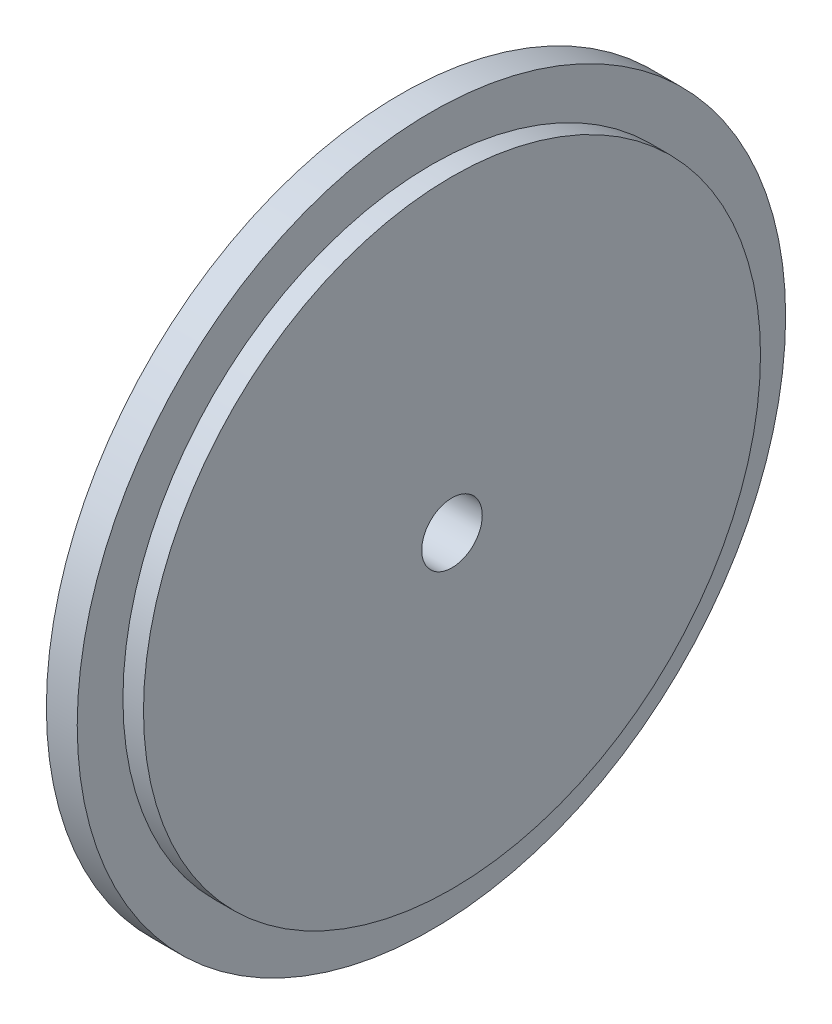
ISO-10303-21;
HEADER;
FILE_DESCRIPTION(('STEP AP214'),'2;1');
FILE_NAME('part.step','',(''),(''),'','','');
FILE_SCHEMA(('AUTOMOTIVE_DESIGN { 1 0 10303 214 1 1 1 1 }'));
ENDSEC;
DATA;
#1=APPLICATION_CONTEXT('core data for automotive mechanical design processes');
#2=APPLICATION_PROTOCOL_DEFINITION('international standard','automotive_design',2000,#1);
#3=PRODUCT_CONTEXT('',#1,'mechanical');
#4=PRODUCT('Part','Part','',(#3));
#5=PRODUCT_RELATED_PRODUCT_CATEGORY('part','',(#4));
#6=PRODUCT_DEFINITION_FORMATION('','',#4);
#7=PRODUCT_DEFINITION_CONTEXT('part definition',#1,'design');
#8=PRODUCT_DEFINITION('design','',#6,#7);
#9=PRODUCT_DEFINITION_SHAPE('','',#8);
#10=(LENGTH_UNIT() NAMED_UNIT(*) SI_UNIT(.MILLI.,.METRE.));
#11=(NAMED_UNIT(*) PLANE_ANGLE_UNIT() SI_UNIT($,.RADIAN.));
#12=(NAMED_UNIT(*) SI_UNIT($,.STERADIAN.) SOLID_ANGLE_UNIT());
#13=UNCERTAINTY_MEASURE_WITH_UNIT(LENGTH_MEASURE(1.E-05),#10,'distance_accuracy_value','');
#14=(GEOMETRIC_REPRESENTATION_CONTEXT(3) GLOBAL_UNCERTAINTY_ASSIGNED_CONTEXT((#13)) GLOBAL_UNIT_ASSIGNED_CONTEXT((#10,
#11,#12)) REPRESENTATION_CONTEXT('',''));
#15=CARTESIAN_POINT('',(0.,0.,0.));
#16=DIRECTION('',(0.,0.,1.));
#17=DIRECTION('',(1.,0.,0.));
#18=AXIS2_PLACEMENT_3D('',#15,#16,#17);
#19=CARTESIAN_POINT('',(4.5,0.,0.));
#20=DIRECTION('',(1.,0.,0.));
#21=DIRECTION('',(0.,0.,-1.));
#22=AXIS2_PLACEMENT_3D('',#19,#20,#21);
#23=PLANE('',#22);
#24=CARTESIAN_POINT('',(4.5,0.,0.));
#25=DIRECTION('',(1.,0.,0.));
#26=DIRECTION('',(0.,0.,-1.));
#27=AXIS2_PLACEMENT_3D('',#24,#25,#26);
#28=CIRCLE('',#27,2.65);
#29=CARTESIAN_POINT('',(4.5,0.,-2.65));
#30=VERTEX_POINT('',#29);
#31=EDGE_CURVE('E41',#30,#30,#28,.T.);
#32=ORIENTED_EDGE('',*,*,#31,.F.);
#33=EDGE_LOOP('',(#32));
#34=FACE_BOUND('',#33,.T.);
#35=CARTESIAN_POINT('',(4.5,0.,0.));
#36=DIRECTION('',(1.,0.,0.));
#37=DIRECTION('',(0.,0.,-1.));
#38=AXIS2_PLACEMENT_3D('',#35,#36,#37);
#39=CIRCLE('',#38,27.);
#40=CARTESIAN_POINT('',(4.5,0.,-27.));
#41=VERTEX_POINT('',#40);
#42=EDGE_CURVE('E50',#41,#41,#39,.T.);
#43=ORIENTED_EDGE('',*,*,#42,.T.);
#44=EDGE_LOOP('',(#43));
#45=FACE_BOUND('',#44,.T.);
#46=ADVANCED_FACE('F33',(#34,#45),#23,.T.);
#47=CARTESIAN_POINT('',(4.5,0.,0.));
#48=DIRECTION('',(-1.,0.,0.));
#49=DIRECTION('',(0.,0.,1.));
#50=AXIS2_PLACEMENT_3D('',#47,#48,#49);
#51=CYLINDRICAL_SURFACE('',#50,31.);
#52=CARTESIAN_POINT('',(0.,0.,0.));
#53=DIRECTION('',(1.,0.,0.));
#54=DIRECTION('',(0.,0.,-1.));
#55=AXIS2_PLACEMENT_3D('',#52,#53,#54);
#56=CIRCLE('',#55,31.);
#57=CARTESIAN_POINT('',(0.,0.,-31.));
#58=VERTEX_POINT('',#57);
#59=EDGE_CURVE('E10',#58,#58,#56,.T.);
#60=ORIENTED_EDGE('',*,*,#59,.T.);
#61=EDGE_LOOP('',(#60));
#62=FACE_BOUND('',#61,.T.);
#63=CARTESIAN_POINT('',(2.7,0.,0.));
#64=DIRECTION('',(1.,0.,0.));
#65=DIRECTION('',(0.,0.,-1.));
#66=AXIS2_PLACEMENT_3D('',#63,#64,#65);
#67=CIRCLE('',#66,31.);
#68=CARTESIAN_POINT('',(2.7,0.,-31.));
#69=VERTEX_POINT('',#68);
#70=EDGE_CURVE('E37',#69,#69,#67,.T.);
#71=ORIENTED_EDGE('',*,*,#70,.F.);
#72=EDGE_LOOP('',(#71));
#73=FACE_BOUND('',#72,.T.);
#74=ADVANCED_FACE('F35',(#62,#73),#51,.T.);
#75=CARTESIAN_POINT('',(0.,0.,0.));
#76=DIRECTION('',(1.,0.,0.));
#77=DIRECTION('',(0.,0.,-1.));
#78=AXIS2_PLACEMENT_3D('',#75,#76,#77);
#79=PLANE('',#78);
#80=ORIENTED_EDGE('',*,*,#59,.F.);
#81=EDGE_LOOP('',(#80));
#82=FACE_BOUND('',#81,.T.);
#83=CARTESIAN_POINT('',(0.,0.,0.));
#84=DIRECTION('',(1.,0.,0.));
#85=DIRECTION('',(0.,0.,-1.));
#86=AXIS2_PLACEMENT_3D('',#83,#84,#85);
#87=CIRCLE('',#86,2.65);
#88=CARTESIAN_POINT('',(0.,0.,-2.65));
#89=VERTEX_POINT('',#88);
#90=EDGE_CURVE('E45',#89,#89,#87,.T.);
#91=ORIENTED_EDGE('',*,*,#90,.T.);
#92=EDGE_LOOP('',(#91));
#93=FACE_BOUND('',#92,.T.);
#94=ADVANCED_FACE('F63',(#82,#93),#79,.F.);
#95=CARTESIAN_POINT('',(4.5,0.,0.));
#96=DIRECTION('',(-1.,0.,0.));
#97=DIRECTION('',(0.,0.,1.));
#98=AXIS2_PLACEMENT_3D('',#95,#96,#97);
#99=CYLINDRICAL_SURFACE('',#98,2.65);
#100=ORIENTED_EDGE('',*,*,#31,.T.);
#101=EDGE_LOOP('',(#100));
#102=FACE_BOUND('',#101,.T.);
#103=ORIENTED_EDGE('',*,*,#90,.F.);
#104=EDGE_LOOP('',(#103));
#105=FACE_BOUND('',#104,.T.);
#106=ADVANCED_FACE('F68',(#102,#105),#99,.F.);
#107=CARTESIAN_POINT('',(2.7,0.,0.));
#108=DIRECTION('',(1.,0.,0.));
#109=DIRECTION('',(0.,0.,-1.));
#110=AXIS2_PLACEMENT_3D('',#107,#108,#109);
#111=PLANE('',#110);
#112=CARTESIAN_POINT('',(2.7,0.,0.));
#113=DIRECTION('',(1.,0.,0.));
#114=DIRECTION('',(0.,0.,-1.));
#115=AXIS2_PLACEMENT_3D('',#112,#113,#114);
#116=CIRCLE('',#115,27.);
#117=CARTESIAN_POINT('',(2.7,0.,-27.));
#118=VERTEX_POINT('',#117);
#119=EDGE_CURVE('E53',#118,#118,#116,.T.);
#120=ORIENTED_EDGE('',*,*,#119,.F.);
#121=EDGE_LOOP('',(#120));
#122=FACE_BOUND('',#121,.T.);
#123=ORIENTED_EDGE('',*,*,#70,.T.);
#124=EDGE_LOOP('',(#123));
#125=FACE_BOUND('',#124,.T.);
#126=ADVANCED_FACE('F60',(#122,#125),#111,.T.);
#127=CARTESIAN_POINT('',(2.7,0.,0.));
#128=DIRECTION('',(1.,0.,0.));
#129=DIRECTION('',(0.,0.,-1.));
#130=AXIS2_PLACEMENT_3D('',#127,#128,#129);
#131=CYLINDRICAL_SURFACE('',#130,27.);
#132=ORIENTED_EDGE('',*,*,#119,.T.);
#133=EDGE_LOOP('',(#132));
#134=FACE_BOUND('',#133,.T.);
#135=ORIENTED_EDGE('',*,*,#42,.F.);
#136=EDGE_LOOP('',(#135));
#137=FACE_BOUND('',#136,.T.);
#138=ADVANCED_FACE('F82',(#134,#137),#131,.T.);
#139=CLOSED_SHELL('',(#46,#74,#94,#106,#126,#138));
#140=MANIFOLD_SOLID_BREP('B2',#139);
#141=ADVANCED_BREP_SHAPE_REPRESENTATION('',(#18,#140),#14);
#142=SHAPE_DEFINITION_REPRESENTATION(#9,#141);
ENDSEC;
END-ISO-10303-21;
